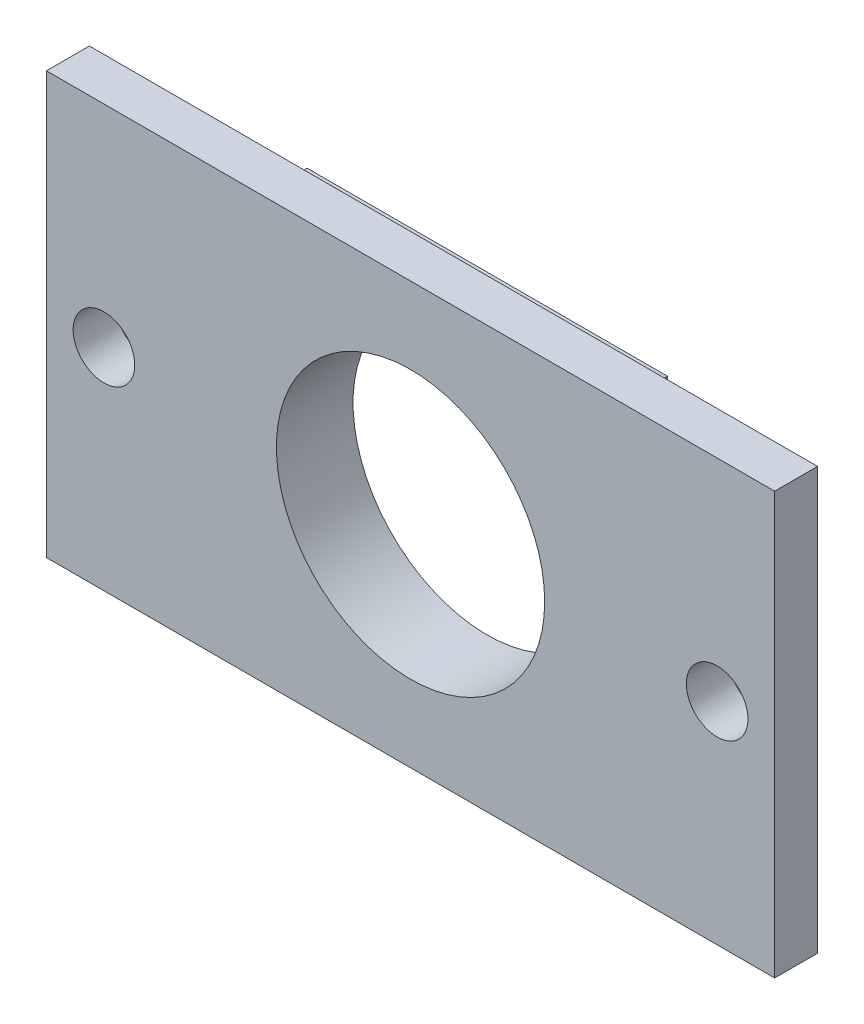
ISO-10303-21;
HEADER;
FILE_DESCRIPTION(('STEP AP214'),'2;1');
FILE_NAME('part.step','',(''),(''),'','','');
FILE_SCHEMA(('AUTOMOTIVE_DESIGN { 1 0 10303 214 1 1 1 1 }'));
ENDSEC;
DATA;
#1=APPLICATION_CONTEXT('core data for automotive mechanical design processes');
#2=APPLICATION_PROTOCOL_DEFINITION('international standard','automotive_design',2000,#1);
#3=PRODUCT_CONTEXT('',#1,'mechanical');
#4=PRODUCT('Part','Part','',(#3));
#5=PRODUCT_RELATED_PRODUCT_CATEGORY('part','',(#4));
#6=PRODUCT_DEFINITION_FORMATION('','',#4);
#7=PRODUCT_DEFINITION_CONTEXT('part definition',#1,'design');
#8=PRODUCT_DEFINITION('design','',#6,#7);
#9=PRODUCT_DEFINITION_SHAPE('','',#8);
#10=(LENGTH_UNIT() NAMED_UNIT(*) SI_UNIT(.MILLI.,.METRE.));
#11=(NAMED_UNIT(*) PLANE_ANGLE_UNIT() SI_UNIT($,.RADIAN.));
#12=(NAMED_UNIT(*) SI_UNIT($,.STERADIAN.) SOLID_ANGLE_UNIT());
#13=UNCERTAINTY_MEASURE_WITH_UNIT(LENGTH_MEASURE(1.E-05),#10,'distance_accuracy_value','');
#14=(GEOMETRIC_REPRESENTATION_CONTEXT(3) GLOBAL_UNCERTAINTY_ASSIGNED_CONTEXT((#13)) GLOBAL_UNIT_ASSIGNED_CONTEXT((#10,
#11,#12)) REPRESENTATION_CONTEXT('',''));
#15=CARTESIAN_POINT('',(0.,0.,0.));
#16=DIRECTION('',(0.,0.,1.));
#17=DIRECTION('',(1.,0.,0.));
#18=AXIS2_PLACEMENT_3D('',#15,#16,#17);
#19=CARTESIAN_POINT('',(45.085,2.54,0.));
#20=DIRECTION('',(-1.,0.,0.));
#21=DIRECTION('',(0.,0.,1.));
#22=AXIS2_PLACEMENT_3D('',#19,#20,#21);
#23=PLANE('',#22);
#24=DIRECTION('',(0.,0.,1.));
#25=VECTOR('',#24,1.);
#26=CARTESIAN_POINT('',(45.085,2.54,0.));
#27=LINE('',#26,#25);
#28=CARTESIAN_POINT('',(45.085,2.54,2.794));
#29=VERTEX_POINT('',#28);
#30=CARTESIAN_POINT('',(45.085,2.54,0.));
#31=VERTEX_POINT('',#30);
#32=EDGE_CURVE('E111',#29,#31,#27,.F.);
#33=ORIENTED_EDGE('',*,*,#32,.T.);
#34=DIRECTION('',(0.,1.,0.));
#35=VECTOR('',#34,1.);
#36=CARTESIAN_POINT('',(45.085,17.4625,0.));
#37=LINE('',#36,#35);
#38=CARTESIAN_POINT('',(45.085,32.385,0.));
#39=VERTEX_POINT('',#38);
#40=EDGE_CURVE('E90',#31,#39,#37,.T.);
#41=ORIENTED_EDGE('',*,*,#40,.T.);
#42=DIRECTION('',(0.,0.,-1.));
#43=VECTOR('',#42,1.);
#44=CARTESIAN_POINT('',(45.085,32.385,0.));
#45=LINE('',#44,#43);
#46=CARTESIAN_POINT('',(45.085,32.385,2.794));
#47=VERTEX_POINT('',#46);
#48=EDGE_CURVE('E85',#39,#47,#45,.F.);
#49=ORIENTED_EDGE('',*,*,#48,.T.);
#50=DIRECTION('',(0.,1.,0.));
#51=VECTOR('',#50,1.);
#52=CARTESIAN_POINT('',(45.085,25.9893321917808,2.794));
#53=LINE('',#52,#51);
#54=EDGE_CURVE('E87',#47,#29,#53,.F.);
#55=ORIENTED_EDGE('',*,*,#54,.T.);
#56=EDGE_LOOP('',(#33,#41,#49,#55));
#57=FACE_BOUND('',#56,.T.);
#58=ADVANCED_FACE('F17',(#57),#23,.F.);
#59=CARTESIAN_POINT('',(45.085,32.385,0.));
#60=DIRECTION('',(0.,-1.,0.));
#61=DIRECTION('',(0.,0.,-1.));
#62=AXIS2_PLACEMENT_3D('',#59,#60,#61);
#63=PLANE('',#62);
#64=DIRECTION('',(1.,0.,0.));
#65=VECTOR('',#64,1.);
#66=CARTESIAN_POINT('',(30.1625,32.385,0.));
#67=LINE('',#66,#65);
#68=CARTESIAN_POINT('',(15.24,32.385,0.));
#69=VERTEX_POINT('',#68);
#70=EDGE_CURVE('E159',#39,#69,#67,.F.);
#71=ORIENTED_EDGE('',*,*,#70,.T.);
#72=DIRECTION('',(0.,0.,-1.));
#73=VECTOR('',#72,1.);
#74=CARTESIAN_POINT('',(15.24,32.385,0.));
#75=LINE('',#74,#73);
#76=CARTESIAN_POINT('',(15.24,32.385,2.794));
#77=VERTEX_POINT('',#76);
#78=EDGE_CURVE('E80',#69,#77,#75,.F.);
#79=ORIENTED_EDGE('',*,*,#78,.T.);
#80=DIRECTION('',(1.,0.,0.));
#81=VECTOR('',#80,1.);
#82=CARTESIAN_POINT('',(22.9056678082192,32.385,2.794));
#83=LINE('',#82,#81);
#84=EDGE_CURVE('E94',#77,#47,#83,.T.);
#85=ORIENTED_EDGE('',*,*,#84,.T.);
#86=ORIENTED_EDGE('',*,*,#48,.F.);
#87=EDGE_LOOP('',(#71,#79,#85,#86));
#88=FACE_BOUND('',#87,.T.);
#89=ADVANCED_FACE('F95',(#88),#63,.F.);
#90=CARTESIAN_POINT('',(15.24,32.385,0.));
#91=DIRECTION('',(1.,0.,0.));
#92=DIRECTION('',(0.,0.,-1.));
#93=AXIS2_PLACEMENT_3D('',#90,#91,#92);
#94=PLANE('',#93);
#95=ORIENTED_EDGE('',*,*,#78,.F.);
#96=DIRECTION('',(0.,1.,0.));
#97=VECTOR('',#96,1.);
#98=CARTESIAN_POINT('',(15.24,17.4625,0.));
#99=LINE('',#98,#97);
#100=CARTESIAN_POINT('',(15.24,2.54,0.));
#101=VERTEX_POINT('',#100);
#102=EDGE_CURVE('E157',#69,#101,#99,.F.);
#103=ORIENTED_EDGE('',*,*,#102,.T.);
#104=DIRECTION('',(0.,0.,1.));
#105=VECTOR('',#104,1.);
#106=CARTESIAN_POINT('',(15.24,2.54,0.));
#107=LINE('',#106,#105);
#108=CARTESIAN_POINT('',(15.24,2.54,2.794));
#109=VERTEX_POINT('',#108);
#110=EDGE_CURVE('E98',#101,#109,#107,.T.);
#111=ORIENTED_EDGE('',*,*,#110,.T.);
#112=DIRECTION('',(0.,1.,0.));
#113=VECTOR('',#112,1.);
#114=CARTESIAN_POINT('',(15.24,25.9893321917808,2.794));
#115=LINE('',#114,#113);
#116=EDGE_CURVE('E106',#109,#77,#115,.T.);
#117=ORIENTED_EDGE('',*,*,#116,.T.);
#118=EDGE_LOOP('',(#95,#103,#111,#117));
#119=FACE_BOUND('',#118,.T.);
#120=ADVANCED_FACE('F162',(#119),#94,.F.);
#121=CARTESIAN_POINT('',(15.24,2.54,0.));
#122=DIRECTION('',(0.,1.,0.));
#123=DIRECTION('',(0.,0.,1.));
#124=AXIS2_PLACEMENT_3D('',#121,#122,#123);
#125=PLANE('',#124);
#126=DIRECTION('',(1.,0.,0.));
#127=VECTOR('',#126,1.);
#128=CARTESIAN_POINT('',(30.1625,2.54,0.));
#129=LINE('',#128,#127);
#130=EDGE_CURVE('E154',#101,#31,#129,.T.);
#131=ORIENTED_EDGE('',*,*,#130,.T.);
#132=ORIENTED_EDGE('',*,*,#32,.F.);
#133=DIRECTION('',(1.,0.,0.));
#134=VECTOR('',#133,1.);
#135=CARTESIAN_POINT('',(22.9056678082192,2.54,2.794));
#136=LINE('',#135,#134);
#137=EDGE_CURVE('E104',#29,#109,#136,.F.);
#138=ORIENTED_EDGE('',*,*,#137,.T.);
#139=ORIENTED_EDGE('',*,*,#110,.F.);
#140=EDGE_LOOP('',(#131,#132,#138,#139));
#141=FACE_BOUND('',#140,.T.);
#142=ADVANCED_FACE('F167',(#141),#125,.F.);
#143=CARTESIAN_POINT('',(22.9056678082192,25.9893321917808,2.794));
#144=DIRECTION('',(0.,0.,1.));
#145=DIRECTION('',(1.,0.,0.));
#146=AXIS2_PLACEMENT_3D('',#143,#144,#145);
#147=PLANE('',#146);
#148=ORIENTED_EDGE('',*,*,#137,.F.);
#149=ORIENTED_EDGE('',*,*,#54,.F.);
#150=ORIENTED_EDGE('',*,*,#84,.F.);
#151=ORIENTED_EDGE('',*,*,#116,.F.);
#152=EDGE_LOOP('',(#148,#149,#150,#151));
#153=FACE_BOUND('',#152,.T.);
#154=CARTESIAN_POINT('',(4.7625,17.4625,2.794));
#155=DIRECTION('',(0.,0.,1.));
#156=DIRECTION('',(1.,0.,0.));
#157=AXIS2_PLACEMENT_3D('',#154,#155,#156);
#158=CIRCLE('',#157,2.5527);
#159=CARTESIAN_POINT('',(7.3152,17.4625,2.794));
#160=VERTEX_POINT('',#159);
#161=EDGE_CURVE('E123',#160,#160,#158,.T.);
#162=ORIENTED_EDGE('',*,*,#161,.T.);
#163=EDGE_LOOP('',(#162));
#164=FACE_BOUND('',#163,.T.);
#165=CARTESIAN_POINT('',(55.5625,17.4625,2.794));
#166=DIRECTION('',(0.,0.,1.));
#167=DIRECTION('',(1.,0.,0.));
#168=AXIS2_PLACEMENT_3D('',#165,#166,#167);
#169=CIRCLE('',#168,2.5527);
#170=CARTESIAN_POINT('',(58.1152,17.4625,2.794));
#171=VERTEX_POINT('',#170);
#172=EDGE_CURVE('E20',#171,#171,#169,.T.);
#173=ORIENTED_EDGE('',*,*,#172,.T.);
#174=EDGE_LOOP('',(#173));
#175=FACE_BOUND('',#174,.T.);
#176=DIRECTION('',(1.,0.,0.));
#177=VECTOR('',#176,1.);
#178=CARTESIAN_POINT('',(0.,34.925,2.794));
#179=LINE('',#178,#177);
#180=CARTESIAN_POINT('',(60.325,34.925,2.794));
#181=VERTEX_POINT('',#180);
#182=CARTESIAN_POINT('',(0.,34.925,2.794));
#183=VERTEX_POINT('',#182);
#184=EDGE_CURVE('E134',#181,#183,#179,.F.);
#185=ORIENTED_EDGE('',*,*,#184,.F.);
#186=DIRECTION('',(0.,1.,0.));
#187=VECTOR('',#186,1.);
#188=CARTESIAN_POINT('',(60.325,34.925,2.794));
#189=LINE('',#188,#187);
#190=CARTESIAN_POINT('',(60.325,0.,2.794));
#191=VERTEX_POINT('',#190);
#192=EDGE_CURVE('E143',#191,#181,#189,.T.);
#193=ORIENTED_EDGE('',*,*,#192,.F.);
#194=DIRECTION('',(1.,0.,0.));
#195=VECTOR('',#194,1.);
#196=CARTESIAN_POINT('',(60.325,0.,2.794));
#197=LINE('',#196,#195);
#198=CARTESIAN_POINT('',(0.,0.,2.794));
#199=VERTEX_POINT('',#198);
#200=EDGE_CURVE('E148',#199,#191,#197,.T.);
#201=ORIENTED_EDGE('',*,*,#200,.F.);
#202=DIRECTION('',(0.,1.,0.));
#203=VECTOR('',#202,1.);
#204=CARTESIAN_POINT('',(0.,0.,2.794));
#205=LINE('',#204,#203);
#206=EDGE_CURVE('E151',#183,#199,#205,.F.);
#207=ORIENTED_EDGE('',*,*,#206,.F.);
#208=EDGE_LOOP('',(#185,#193,#201,#207));
#209=FACE_BOUND('',#208,.T.);
#210=ADVANCED_FACE('F101',(#153,#164,#175,#209),#147,.F.);
#211=CARTESIAN_POINT('',(30.1625,17.4625,0.));
#212=DIRECTION('',(0.,0.,1.));
#213=DIRECTION('',(1.,0.,0.));
#214=AXIS2_PLACEMENT_3D('',#211,#212,#213);
#215=PLANE('',#214);
#216=CARTESIAN_POINT('',(30.1625,17.4625,0.));
#217=DIRECTION('',(0.,0.,1.));
#218=DIRECTION('',(1.,0.,0.));
#219=AXIS2_PLACEMENT_3D('',#216,#217,#218);
#220=CIRCLE('',#219,11.1125);
#221=CARTESIAN_POINT('',(41.275,17.4625,0.));
#222=VERTEX_POINT('',#221);
#223=EDGE_CURVE('E120',#222,#222,#220,.T.);
#224=ORIENTED_EDGE('',*,*,#223,.T.);
#225=EDGE_LOOP('',(#224));
#226=FACE_BOUND('',#225,.T.);
#227=ORIENTED_EDGE('',*,*,#102,.F.);
#228=ORIENTED_EDGE('',*,*,#70,.F.);
#229=ORIENTED_EDGE('',*,*,#40,.F.);
#230=ORIENTED_EDGE('',*,*,#130,.F.);
#231=EDGE_LOOP('',(#227,#228,#229,#230));
#232=FACE_BOUND('',#231,.T.);
#233=ADVANCED_FACE('F169',(#226,#232),#215,.F.);
#234=CARTESIAN_POINT('',(0.,0.,0.));
#235=DIRECTION('',(-1.,0.,0.));
#236=DIRECTION('',(0.,0.,1.));
#237=AXIS2_PLACEMENT_3D('',#234,#235,#236);
#238=PLANE('',#237);
#239=DIRECTION('',(0.,1.,0.));
#240=VECTOR('',#239,1.);
#241=CARTESIAN_POINT('',(0.,17.4625,6.35));
#242=LINE('',#241,#240);
#243=CARTESIAN_POINT('',(0.,34.925,6.35));
#244=VERTEX_POINT('',#243);
#245=CARTESIAN_POINT('',(0.,0.,6.35));
#246=VERTEX_POINT('',#245);
#247=EDGE_CURVE('E122',#244,#246,#242,.F.);
#248=ORIENTED_EDGE('',*,*,#247,.F.);
#249=DIRECTION('',(0.,0.,1.));
#250=VECTOR('',#249,1.);
#251=CARTESIAN_POINT('',(0.,34.925,0.));
#252=LINE('',#251,#250);
#253=EDGE_CURVE('E129',#183,#244,#252,.T.);
#254=ORIENTED_EDGE('',*,*,#253,.F.);
#255=ORIENTED_EDGE('',*,*,#206,.T.);
#256=DIRECTION('',(0.,0.,-1.));
#257=VECTOR('',#256,1.);
#258=CARTESIAN_POINT('',(0.,0.,0.));
#259=LINE('',#258,#257);
#260=EDGE_CURVE('E145',#246,#199,#259,.T.);
#261=ORIENTED_EDGE('',*,*,#260,.F.);
#262=EDGE_LOOP('',(#248,#254,#255,#261));
#263=FACE_BOUND('',#262,.T.);
#264=ADVANCED_FACE('F171',(#263),#238,.T.);
#265=CARTESIAN_POINT('',(60.325,0.,0.));
#266=DIRECTION('',(0.,-1.,0.));
#267=DIRECTION('',(0.,0.,-1.));
#268=AXIS2_PLACEMENT_3D('',#265,#266,#267);
#269=PLANE('',#268);
#270=DIRECTION('',(1.,0.,0.));
#271=VECTOR('',#270,1.);
#272=CARTESIAN_POINT('',(30.1625,0.,6.35));
#273=LINE('',#272,#271);
#274=CARTESIAN_POINT('',(60.325,0.,6.35));
#275=VERTEX_POINT('',#274);
#276=EDGE_CURVE('E215',#246,#275,#273,.T.);
#277=ORIENTED_EDGE('',*,*,#276,.F.);
#278=ORIENTED_EDGE('',*,*,#260,.T.);
#279=ORIENTED_EDGE('',*,*,#200,.T.);
#280=DIRECTION('',(0.,0.,-1.));
#281=VECTOR('',#280,1.);
#282=CARTESIAN_POINT('',(60.325,0.,0.));
#283=LINE('',#282,#281);
#284=EDGE_CURVE('E140',#275,#191,#283,.T.);
#285=ORIENTED_EDGE('',*,*,#284,.F.);
#286=EDGE_LOOP('',(#277,#278,#279,#285));
#287=FACE_BOUND('',#286,.T.);
#288=ADVANCED_FACE('F179',(#287),#269,.T.);
#289=CARTESIAN_POINT('',(60.325,34.925,0.));
#290=DIRECTION('',(1.,0.,0.));
#291=DIRECTION('',(0.,0.,-1.));
#292=AXIS2_PLACEMENT_3D('',#289,#290,#291);
#293=PLANE('',#292);
#294=DIRECTION('',(0.,1.,0.));
#295=VECTOR('',#294,1.);
#296=CARTESIAN_POINT('',(60.325,17.4625,6.35));
#297=LINE('',#296,#295);
#298=CARTESIAN_POINT('',(60.325,34.925,6.35));
#299=VERTEX_POINT('',#298);
#300=EDGE_CURVE('E219',#275,#299,#297,.T.);
#301=ORIENTED_EDGE('',*,*,#300,.F.);
#302=ORIENTED_EDGE('',*,*,#284,.T.);
#303=ORIENTED_EDGE('',*,*,#192,.T.);
#304=DIRECTION('',(0.,0.,1.));
#305=VECTOR('',#304,1.);
#306=CARTESIAN_POINT('',(60.325,34.925,0.));
#307=LINE('',#306,#305);
#308=EDGE_CURVE('E35',#299,#181,#307,.F.);
#309=ORIENTED_EDGE('',*,*,#308,.F.);
#310=EDGE_LOOP('',(#301,#302,#303,#309));
#311=FACE_BOUND('',#310,.T.);
#312=ADVANCED_FACE('F206',(#311),#293,.T.);
#313=CARTESIAN_POINT('',(0.,34.925,0.));
#314=DIRECTION('',(0.,1.,0.));
#315=DIRECTION('',(0.,0.,1.));
#316=AXIS2_PLACEMENT_3D('',#313,#314,#315);
#317=PLANE('',#316);
#318=DIRECTION('',(1.,0.,0.));
#319=VECTOR('',#318,1.);
#320=CARTESIAN_POINT('',(30.1625,34.925,6.35));
#321=LINE('',#320,#319);
#322=EDGE_CURVE('E119',#299,#244,#321,.F.);
#323=ORIENTED_EDGE('',*,*,#322,.F.);
#324=ORIENTED_EDGE('',*,*,#308,.T.);
#325=ORIENTED_EDGE('',*,*,#184,.T.);
#326=ORIENTED_EDGE('',*,*,#253,.T.);
#327=EDGE_LOOP('',(#323,#324,#325,#326));
#328=FACE_BOUND('',#327,.T.);
#329=ADVANCED_FACE('F202',(#328),#317,.T.);
#330=CARTESIAN_POINT('',(55.5625,17.4625,-63.6441694000293));
#331=DIRECTION('',(0.,0.,1.));
#332=DIRECTION('',(1.,0.,0.));
#333=AXIS2_PLACEMENT_3D('',#330,#331,#332);
#334=CYLINDRICAL_SURFACE('',#333,2.5527);
#335=CARTESIAN_POINT('',(55.5625,17.4625,6.34999999999999));
#336=DIRECTION('',(0.,0.,1.));
#337=DIRECTION('',(1.,0.,0.));
#338=AXIS2_PLACEMENT_3D('',#335,#336,#337);
#339=CIRCLE('',#338,2.5527);
#340=CARTESIAN_POINT('',(58.1152,17.4625,6.34999999999999));
#341=VERTEX_POINT('',#340);
#342=EDGE_CURVE('E116',#341,#341,#339,.F.);
#343=ORIENTED_EDGE('',*,*,#342,.F.);
#344=EDGE_LOOP('',(#343));
#345=FACE_BOUND('',#344,.T.);
#346=ORIENTED_EDGE('',*,*,#172,.F.);
#347=EDGE_LOOP('',(#346));
#348=FACE_BOUND('',#347,.T.);
#349=ADVANCED_FACE('F198',(#345,#348),#334,.F.);
#350=CARTESIAN_POINT('',(4.7625,17.4625,-63.6441694000293));
#351=DIRECTION('',(0.,0.,1.));
#352=DIRECTION('',(1.,0.,0.));
#353=AXIS2_PLACEMENT_3D('',#350,#351,#352);
#354=CYLINDRICAL_SURFACE('',#353,2.5527);
#355=CARTESIAN_POINT('',(4.7625,17.4625,6.34999999999999));
#356=DIRECTION('',(0.,0.,1.));
#357=DIRECTION('',(1.,0.,0.));
#358=AXIS2_PLACEMENT_3D('',#355,#356,#357);
#359=CIRCLE('',#358,2.5527);
#360=CARTESIAN_POINT('',(7.3152,17.4625,6.34999999999999));
#361=VERTEX_POINT('',#360);
#362=EDGE_CURVE('E26',#361,#361,#359,.F.);
#363=ORIENTED_EDGE('',*,*,#362,.F.);
#364=EDGE_LOOP('',(#363));
#365=FACE_BOUND('',#364,.T.);
#366=ORIENTED_EDGE('',*,*,#161,.F.);
#367=EDGE_LOOP('',(#366));
#368=FACE_BOUND('',#367,.T.);
#369=ADVANCED_FACE('F191',(#365,#368),#354,.F.);
#370=CARTESIAN_POINT('',(30.1625,17.4625,0.));
#371=DIRECTION('',(0.,0.,1.));
#372=DIRECTION('',(1.,0.,0.));
#373=AXIS2_PLACEMENT_3D('',#370,#371,#372);
#374=CYLINDRICAL_SURFACE('',#373,11.1125);
#375=ORIENTED_EDGE('',*,*,#223,.F.);
#376=EDGE_LOOP('',(#375));
#377=FACE_BOUND('',#376,.T.);
#378=CARTESIAN_POINT('',(30.1625,17.4625,6.35));
#379=DIRECTION('',(0.,0.,1.));
#380=DIRECTION('',(1.,0.,0.));
#381=AXIS2_PLACEMENT_3D('',#378,#379,#380);
#382=CIRCLE('',#381,11.1125);
#383=CARTESIAN_POINT('',(41.275,17.4625,6.35));
#384=VERTEX_POINT('',#383);
#385=EDGE_CURVE('E11',#384,#384,#382,.F.);
#386=ORIENTED_EDGE('',*,*,#385,.F.);
#387=EDGE_LOOP('',(#386));
#388=FACE_BOUND('',#387,.T.);
#389=ADVANCED_FACE('F185',(#377,#388),#374,.F.);
#390=CARTESIAN_POINT('',(30.1625,17.4625,6.35));
#391=DIRECTION('',(0.,0.,1.));
#392=DIRECTION('',(1.,0.,0.));
#393=AXIS2_PLACEMENT_3D('',#390,#391,#392);
#394=PLANE('',#393);
#395=ORIENTED_EDGE('',*,*,#385,.T.);
#396=EDGE_LOOP('',(#395));
#397=FACE_BOUND('',#396,.T.);
#398=ORIENTED_EDGE('',*,*,#362,.T.);
#399=EDGE_LOOP('',(#398));
#400=FACE_BOUND('',#399,.T.);
#401=ORIENTED_EDGE('',*,*,#342,.T.);
#402=EDGE_LOOP('',(#401));
#403=FACE_BOUND('',#402,.T.);
#404=ORIENTED_EDGE('',*,*,#300,.T.);
#405=ORIENTED_EDGE('',*,*,#322,.T.);
#406=ORIENTED_EDGE('',*,*,#247,.T.);
#407=ORIENTED_EDGE('',*,*,#276,.T.);
#408=EDGE_LOOP('',(#404,#405,#406,#407));
#409=FACE_BOUND('',#408,.T.);
#410=ADVANCED_FACE('F183',(#397,#400,#403,#409),#394,.T.);
#411=CLOSED_SHELL('',(#58,#89,#120,#142,#210,#233,#264,#288,#312,#329,#349,#369,#389,#410));
#412=MANIFOLD_SOLID_BREP('B1',#411);
#413=ADVANCED_BREP_SHAPE_REPRESENTATION('',(#18,#412),#14);
#414=SHAPE_DEFINITION_REPRESENTATION(#9,#413);
ENDSEC;
END-ISO-10303-21;
